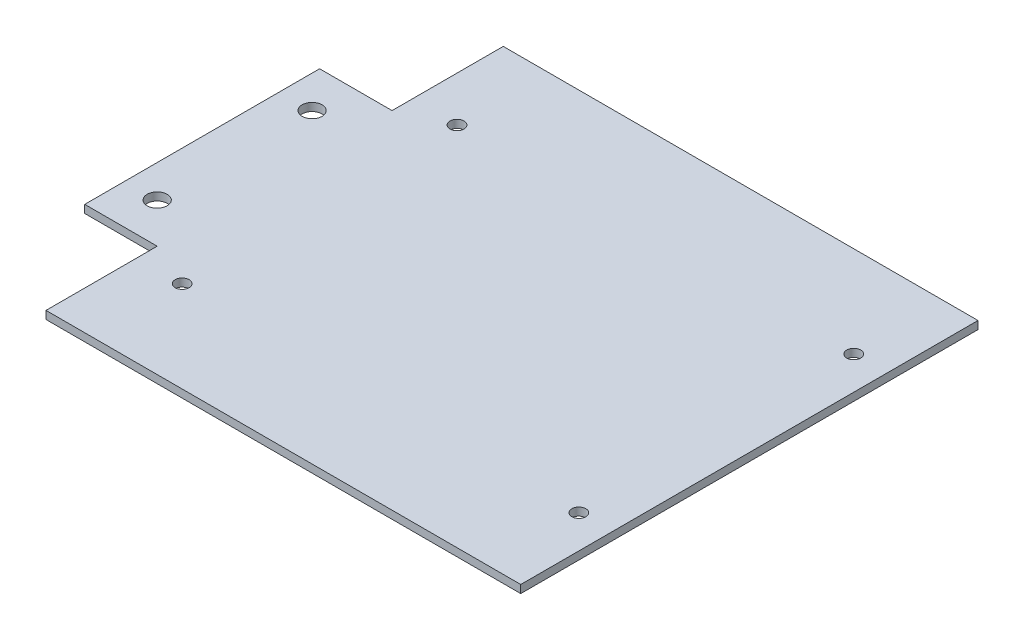
ISO-10303-21;
HEADER;
FILE_DESCRIPTION(('STEP AP214'),'2;1');
FILE_NAME('part.step','',(''),(''),'','','');
FILE_SCHEMA(('AUTOMOTIVE_DESIGN { 1 0 10303 214 1 1 1 1 }'));
ENDSEC;
DATA;
#1=APPLICATION_CONTEXT('core data for automotive mechanical design processes');
#2=APPLICATION_PROTOCOL_DEFINITION('international standard','automotive_design',2000,#1);
#3=PRODUCT_CONTEXT('',#1,'mechanical');
#4=PRODUCT('Part','Part','',(#3));
#5=PRODUCT_RELATED_PRODUCT_CATEGORY('part','',(#4));
#6=PRODUCT_DEFINITION_FORMATION('','',#4);
#7=PRODUCT_DEFINITION_CONTEXT('part definition',#1,'design');
#8=PRODUCT_DEFINITION('design','',#6,#7);
#9=PRODUCT_DEFINITION_SHAPE('','',#8);
#10=(LENGTH_UNIT() NAMED_UNIT(*) SI_UNIT(.MILLI.,.METRE.));
#11=(NAMED_UNIT(*) PLANE_ANGLE_UNIT() SI_UNIT($,.RADIAN.));
#12=(NAMED_UNIT(*) SI_UNIT($,.STERADIAN.) SOLID_ANGLE_UNIT());
#13=UNCERTAINTY_MEASURE_WITH_UNIT(LENGTH_MEASURE(1.E-05),#10,'distance_accuracy_value','');
#14=(GEOMETRIC_REPRESENTATION_CONTEXT(3) GLOBAL_UNCERTAINTY_ASSIGNED_CONTEXT((#13)) GLOBAL_UNIT_ASSIGNED_CONTEXT((#10,
#11,#12)) REPRESENTATION_CONTEXT('',''));
#15=CARTESIAN_POINT('',(0.,0.,0.));
#16=DIRECTION('',(0.,0.,1.));
#17=DIRECTION('',(1.,0.,0.));
#18=AXIS2_PLACEMENT_3D('',#15,#16,#17);
#19=CARTESIAN_POINT('',(95.,-3.17,-91.5));
#20=DIRECTION('',(1.,0.,0.));
#21=DIRECTION('',(0.,0.,-1.));
#22=AXIS2_PLACEMENT_3D('',#19,#20,#21);
#23=PLANE('',#22);
#24=DIRECTION('',(0.,0.,-1.));
#25=VECTOR('',#24,1.);
#26=CARTESIAN_POINT('',(95.,0.,-91.5));
#27=LINE('',#26,#25);
#28=CARTESIAN_POINT('',(95.,0.,91.5));
#29=VERTEX_POINT('',#28);
#30=CARTESIAN_POINT('',(95.,0.,-91.5));
#31=VERTEX_POINT('',#30);
#32=EDGE_CURVE('E139',#29,#31,#27,.T.);
#33=ORIENTED_EDGE('',*,*,#32,.F.);
#34=DIRECTION('',(0.,1.,0.));
#35=VECTOR('',#34,1.);
#36=CARTESIAN_POINT('',(95.,-3.17,91.5));
#37=LINE('',#36,#35);
#38=CARTESIAN_POINT('',(95.,-3.17,91.5));
#39=VERTEX_POINT('',#38);
#40=EDGE_CURVE('E11',#39,#29,#37,.T.);
#41=ORIENTED_EDGE('',*,*,#40,.F.);
#42=DIRECTION('',(0.,0.,-1.));
#43=VECTOR('',#42,1.);
#44=CARTESIAN_POINT('',(95.,-3.17,-91.5));
#45=LINE('',#44,#43);
#46=CARTESIAN_POINT('',(95.,-3.17,-91.5));
#47=VERTEX_POINT('',#46);
#48=EDGE_CURVE('E163',#39,#47,#45,.T.);
#49=ORIENTED_EDGE('',*,*,#48,.T.);
#50=DIRECTION('',(0.,1.,0.));
#51=VECTOR('',#50,1.);
#52=CARTESIAN_POINT('',(95.,-3.17,-91.5));
#53=LINE('',#52,#51);
#54=EDGE_CURVE('E46',#47,#31,#53,.T.);
#55=ORIENTED_EDGE('',*,*,#54,.T.);
#56=EDGE_LOOP('',(#33,#41,#49,#55));
#57=FACE_BOUND('',#56,.T.);
#58=ADVANCED_FACE('F43',(#57),#23,.T.);
#59=CARTESIAN_POINT('',(-95.,-3.17,91.5));
#60=DIRECTION('',(0.,0.,1.));
#61=DIRECTION('',(1.,0.,0.));
#62=AXIS2_PLACEMENT_3D('',#59,#60,#61);
#63=PLANE('',#62);
#64=DIRECTION('',(1.,0.,0.));
#65=VECTOR('',#64,1.);
#66=CARTESIAN_POINT('',(-95.,0.,91.5));
#67=LINE('',#66,#65);
#68=CARTESIAN_POINT('',(-95.,0.,91.5));
#69=VERTEX_POINT('',#68);
#70=EDGE_CURVE('E159',#69,#29,#67,.T.);
#71=ORIENTED_EDGE('',*,*,#70,.F.);
#72=DIRECTION('',(0.,1.,0.));
#73=VECTOR('',#72,1.);
#74=CARTESIAN_POINT('',(-95.,-3.17,91.5));
#75=LINE('',#74,#73);
#76=CARTESIAN_POINT('',(-95.,-3.17,91.5));
#77=VERTEX_POINT('',#76);
#78=EDGE_CURVE('E55',#77,#69,#75,.T.);
#79=ORIENTED_EDGE('',*,*,#78,.F.);
#80=DIRECTION('',(1.,0.,0.));
#81=VECTOR('',#80,1.);
#82=CARTESIAN_POINT('',(-95.,-3.17,91.5));
#83=LINE('',#82,#81);
#84=EDGE_CURVE('E128',#77,#39,#83,.T.);
#85=ORIENTED_EDGE('',*,*,#84,.T.);
#86=ORIENTED_EDGE('',*,*,#40,.T.);
#87=EDGE_LOOP('',(#71,#79,#85,#86));
#88=FACE_BOUND('',#87,.T.);
#89=ADVANCED_FACE('F173',(#88),#63,.T.);
#90=CARTESIAN_POINT('',(-95.,-3.17,47.));
#91=DIRECTION('',(-1.,0.,0.));
#92=DIRECTION('',(0.,0.,1.));
#93=AXIS2_PLACEMENT_3D('',#90,#91,#92);
#94=PLANE('',#93);
#95=DIRECTION('',(0.,0.,1.));
#96=VECTOR('',#95,1.);
#97=CARTESIAN_POINT('',(-95.,0.,47.));
#98=LINE('',#97,#96);
#99=CARTESIAN_POINT('',(-95.,0.,47.));
#100=VERTEX_POINT('',#99);
#101=EDGE_CURVE('E120',#100,#69,#98,.T.);
#102=ORIENTED_EDGE('',*,*,#101,.F.);
#103=DIRECTION('',(0.,1.,0.));
#104=VECTOR('',#103,1.);
#105=CARTESIAN_POINT('',(-95.,-3.17,47.));
#106=LINE('',#105,#104);
#107=CARTESIAN_POINT('',(-95.,-3.17,47.));
#108=VERTEX_POINT('',#107);
#109=EDGE_CURVE('E115',#108,#100,#106,.T.);
#110=ORIENTED_EDGE('',*,*,#109,.F.);
#111=DIRECTION('',(0.,0.,1.));
#112=VECTOR('',#111,1.);
#113=CARTESIAN_POINT('',(-95.,-3.17,47.));
#114=LINE('',#113,#112);
#115=EDGE_CURVE('E114',#108,#77,#114,.T.);
#116=ORIENTED_EDGE('',*,*,#115,.T.);
#117=ORIENTED_EDGE('',*,*,#78,.T.);
#118=EDGE_LOOP('',(#102,#110,#116,#117));
#119=FACE_BOUND('',#118,.T.);
#120=ADVANCED_FACE('F112',(#119),#94,.T.);
#121=CARTESIAN_POINT('',(-124.,-3.17,47.));
#122=DIRECTION('',(0.,0.,1.));
#123=DIRECTION('',(1.,0.,0.));
#124=AXIS2_PLACEMENT_3D('',#121,#122,#123);
#125=PLANE('',#124);
#126=DIRECTION('',(1.,0.,0.));
#127=VECTOR('',#126,1.);
#128=CARTESIAN_POINT('',(-124.,0.,47.));
#129=LINE('',#128,#127);
#130=CARTESIAN_POINT('',(-124.,0.,47.));
#131=VERTEX_POINT('',#130);
#132=EDGE_CURVE('E158',#131,#100,#129,.T.);
#133=ORIENTED_EDGE('',*,*,#132,.F.);
#134=DIRECTION('',(0.,1.,0.));
#135=VECTOR('',#134,1.);
#136=CARTESIAN_POINT('',(-124.,-3.17,47.));
#137=LINE('',#136,#135);
#138=CARTESIAN_POINT('',(-124.,-3.17,47.));
#139=VERTEX_POINT('',#138);
#140=EDGE_CURVE('E125',#139,#131,#137,.T.);
#141=ORIENTED_EDGE('',*,*,#140,.F.);
#142=DIRECTION('',(1.,0.,0.));
#143=VECTOR('',#142,1.);
#144=CARTESIAN_POINT('',(-124.,-3.17,47.));
#145=LINE('',#144,#143);
#146=EDGE_CURVE('E129',#139,#108,#145,.T.);
#147=ORIENTED_EDGE('',*,*,#146,.T.);
#148=ORIENTED_EDGE('',*,*,#109,.T.);
#149=EDGE_LOOP('',(#133,#141,#147,#148));
#150=FACE_BOUND('',#149,.T.);
#151=ADVANCED_FACE('F134',(#150),#125,.T.);
#152=CARTESIAN_POINT('',(-124.,-3.17,-47.));
#153=DIRECTION('',(-1.,0.,0.));
#154=DIRECTION('',(0.,0.,1.));
#155=AXIS2_PLACEMENT_3D('',#152,#153,#154);
#156=PLANE('',#155);
#157=DIRECTION('',(0.,0.,1.));
#158=VECTOR('',#157,1.);
#159=CARTESIAN_POINT('',(-124.,0.,-47.));
#160=LINE('',#159,#158);
#161=CARTESIAN_POINT('',(-124.,0.,-47.));
#162=VERTEX_POINT('',#161);
#163=EDGE_CURVE('E152',#162,#131,#160,.T.);
#164=ORIENTED_EDGE('',*,*,#163,.F.);
#165=DIRECTION('',(0.,1.,0.));
#166=VECTOR('',#165,1.);
#167=CARTESIAN_POINT('',(-124.,-3.17,-47.));
#168=LINE('',#167,#166);
#169=CARTESIAN_POINT('',(-124.,-3.17,-47.));
#170=VERTEX_POINT('',#169);
#171=EDGE_CURVE('E164',#170,#162,#168,.T.);
#172=ORIENTED_EDGE('',*,*,#171,.F.);
#173=DIRECTION('',(0.,0.,1.));
#174=VECTOR('',#173,1.);
#175=CARTESIAN_POINT('',(-124.,-3.17,-47.));
#176=LINE('',#175,#174);
#177=EDGE_CURVE('E132',#170,#139,#176,.T.);
#178=ORIENTED_EDGE('',*,*,#177,.T.);
#179=ORIENTED_EDGE('',*,*,#140,.T.);
#180=EDGE_LOOP('',(#164,#172,#178,#179));
#181=FACE_BOUND('',#180,.T.);
#182=ADVANCED_FACE('F187',(#181),#156,.T.);
#183=CARTESIAN_POINT('',(-95.,-3.17,-47.));
#184=DIRECTION('',(0.,0.,-1.));
#185=DIRECTION('',(-1.,0.,0.));
#186=AXIS2_PLACEMENT_3D('',#183,#184,#185);
#187=PLANE('',#186);
#188=DIRECTION('',(-1.,0.,0.));
#189=VECTOR('',#188,1.);
#190=CARTESIAN_POINT('',(-95.,0.,-47.));
#191=LINE('',#190,#189);
#192=CARTESIAN_POINT('',(-95.,0.,-47.));
#193=VERTEX_POINT('',#192);
#194=EDGE_CURVE('E148',#193,#162,#191,.T.);
#195=ORIENTED_EDGE('',*,*,#194,.F.);
#196=DIRECTION('',(0.,1.,0.));
#197=VECTOR('',#196,1.);
#198=CARTESIAN_POINT('',(-95.,-3.17,-47.));
#199=LINE('',#198,#197);
#200=CARTESIAN_POINT('',(-95.,-3.17,-47.));
#201=VERTEX_POINT('',#200);
#202=EDGE_CURVE('E170',#201,#193,#199,.T.);
#203=ORIENTED_EDGE('',*,*,#202,.F.);
#204=DIRECTION('',(-1.,0.,0.));
#205=VECTOR('',#204,1.);
#206=CARTESIAN_POINT('',(-95.,-3.17,-47.));
#207=LINE('',#206,#205);
#208=EDGE_CURVE('E131',#201,#170,#207,.T.);
#209=ORIENTED_EDGE('',*,*,#208,.T.);
#210=ORIENTED_EDGE('',*,*,#171,.T.);
#211=EDGE_LOOP('',(#195,#203,#209,#210));
#212=FACE_BOUND('',#211,.T.);
#213=ADVANCED_FACE('F186',(#212),#187,.T.);
#214=CARTESIAN_POINT('',(-95.,-3.17,-91.5));
#215=DIRECTION('',(-1.,0.,0.));
#216=DIRECTION('',(0.,0.,1.));
#217=AXIS2_PLACEMENT_3D('',#214,#215,#216);
#218=PLANE('',#217);
#219=DIRECTION('',(0.,0.,1.));
#220=VECTOR('',#219,1.);
#221=CARTESIAN_POINT('',(-95.,0.,-91.5));
#222=LINE('',#221,#220);
#223=CARTESIAN_POINT('',(-95.,0.,-91.5));
#224=VERTEX_POINT('',#223);
#225=EDGE_CURVE('E150',#224,#193,#222,.T.);
#226=ORIENTED_EDGE('',*,*,#225,.F.);
#227=DIRECTION('',(0.,1.,0.));
#228=VECTOR('',#227,1.);
#229=CARTESIAN_POINT('',(-95.,-3.17,-91.5));
#230=LINE('',#229,#228);
#231=CARTESIAN_POINT('',(-95.,-3.17,-91.5));
#232=VERTEX_POINT('',#231);
#233=EDGE_CURVE('E166',#232,#224,#230,.T.);
#234=ORIENTED_EDGE('',*,*,#233,.F.);
#235=DIRECTION('',(0.,0.,1.));
#236=VECTOR('',#235,1.);
#237=CARTESIAN_POINT('',(-95.,-3.17,-91.5));
#238=LINE('',#237,#236);
#239=EDGE_CURVE('E273',#232,#201,#238,.T.);
#240=ORIENTED_EDGE('',*,*,#239,.T.);
#241=ORIENTED_EDGE('',*,*,#202,.T.);
#242=EDGE_LOOP('',(#226,#234,#240,#241));
#243=FACE_BOUND('',#242,.T.);
#244=ADVANCED_FACE('F194',(#243),#218,.T.);
#245=CARTESIAN_POINT('',(-95.,-3.17,-91.5));
#246=DIRECTION('',(0.,0.,-1.));
#247=DIRECTION('',(-1.,0.,0.));
#248=AXIS2_PLACEMENT_3D('',#245,#246,#247);
#249=PLANE('',#248);
#250=DIRECTION('',(-1.,0.,0.));
#251=VECTOR('',#250,1.);
#252=CARTESIAN_POINT('',(-95.,0.,-91.5));
#253=LINE('',#252,#251);
#254=EDGE_CURVE('E141',#31,#224,#253,.T.);
#255=ORIENTED_EDGE('',*,*,#254,.F.);
#256=ORIENTED_EDGE('',*,*,#54,.F.);
#257=DIRECTION('',(-1.,0.,0.));
#258=VECTOR('',#257,1.);
#259=CARTESIAN_POINT('',(-95.,-3.17,-91.5));
#260=LINE('',#259,#258);
#261=EDGE_CURVE('E271',#47,#232,#260,.T.);
#262=ORIENTED_EDGE('',*,*,#261,.T.);
#263=ORIENTED_EDGE('',*,*,#233,.T.);
#264=EDGE_LOOP('',(#255,#256,#262,#263));
#265=FACE_BOUND('',#264,.T.);
#266=ADVANCED_FACE('F167',(#265),#249,.T.);
#267=CARTESIAN_POINT('',(0.,-3.17,0.));
#268=DIRECTION('',(0.,1.,0.));
#269=DIRECTION('',(0.,0.,1.));
#270=AXIS2_PLACEMENT_3D('',#267,#268,#269);
#271=PLANE('',#270);
#272=CARTESIAN_POINT('',(-111.,-3.17,31.));
#273=DIRECTION('',(0.,1.,0.));
#274=DIRECTION('',(0.,0.,1.));
#275=AXIS2_PLACEMENT_3D('',#272,#273,#274);
#276=CIRCLE('',#275,4.00000000000001);
#277=CARTESIAN_POINT('',(-111.,-3.17,35.));
#278=VERTEX_POINT('',#277);
#279=EDGE_CURVE('E236',#278,#278,#276,.T.);
#280=ORIENTED_EDGE('',*,*,#279,.T.);
#281=EDGE_LOOP('',(#280));
#282=FACE_BOUND('',#281,.T.);
#283=CARTESIAN_POINT('',(-111.,-3.17,-31.));
#284=DIRECTION('',(0.,1.,0.));
#285=DIRECTION('',(0.,0.,1.));
#286=AXIS2_PLACEMENT_3D('',#283,#284,#285);
#287=CIRCLE('',#286,4.00000000000001);
#288=CARTESIAN_POINT('',(-111.,-3.17,-27.));
#289=VERTEX_POINT('',#288);
#290=EDGE_CURVE('E242',#289,#289,#287,.T.);
#291=ORIENTED_EDGE('',*,*,#290,.T.);
#292=EDGE_LOOP('',(#291));
#293=FACE_BOUND('',#292,.T.);
#294=CARTESIAN_POINT('',(81.76,-3.17,-55.0037));
#295=DIRECTION('',(0.,1.,0.));
#296=DIRECTION('',(0.,0.,1.));
#297=AXIS2_PLACEMENT_3D('',#294,#295,#296);
#298=CIRCLE('',#297,2.79999999999999);
#299=CARTESIAN_POINT('',(81.76,-3.17,-52.2037));
#300=VERTEX_POINT('',#299);
#301=EDGE_CURVE('E249',#300,#300,#298,.T.);
#302=ORIENTED_EDGE('',*,*,#301,.T.);
#303=EDGE_LOOP('',(#302));
#304=FACE_BOUND('',#303,.T.);
#305=CARTESIAN_POINT('',(81.76,-3.17,55.0037));
#306=DIRECTION('',(0.,1.,0.));
#307=DIRECTION('',(0.,0.,1.));
#308=AXIS2_PLACEMENT_3D('',#305,#306,#307);
#309=CIRCLE('',#308,2.79999999999999);
#310=CARTESIAN_POINT('',(81.76,-3.17,57.8037));
#311=VERTEX_POINT('',#310);
#312=EDGE_CURVE('E257',#311,#311,#309,.T.);
#313=ORIENTED_EDGE('',*,*,#312,.T.);
#314=EDGE_LOOP('',(#313));
#315=FACE_BOUND('',#314,.T.);
#316=CARTESIAN_POINT('',(-77.,-3.17,55.0037));
#317=DIRECTION('',(0.,1.,0.));
#318=DIRECTION('',(0.,0.,1.));
#319=AXIS2_PLACEMENT_3D('',#316,#317,#318);
#320=CIRCLE('',#319,2.79999999999999);
#321=CARTESIAN_POINT('',(-77.,-3.17,57.8037));
#322=VERTEX_POINT('',#321);
#323=EDGE_CURVE('E264',#322,#322,#320,.T.);
#324=ORIENTED_EDGE('',*,*,#323,.T.);
#325=EDGE_LOOP('',(#324));
#326=FACE_BOUND('',#325,.T.);
#327=CARTESIAN_POINT('',(-77.,-3.17,-55.0037));
#328=DIRECTION('',(0.,1.,0.));
#329=DIRECTION('',(0.,0.,1.));
#330=AXIS2_PLACEMENT_3D('',#327,#328,#329);
#331=CIRCLE('',#330,2.79999999999999);
#332=CARTESIAN_POINT('',(-77.,-3.17,-52.2037));
#333=VERTEX_POINT('',#332);
#334=EDGE_CURVE('E144',#333,#333,#331,.T.);
#335=ORIENTED_EDGE('',*,*,#334,.T.);
#336=EDGE_LOOP('',(#335));
#337=FACE_BOUND('',#336,.T.);
#338=ORIENTED_EDGE('',*,*,#48,.F.);
#339=ORIENTED_EDGE('',*,*,#84,.F.);
#340=ORIENTED_EDGE('',*,*,#115,.F.);
#341=ORIENTED_EDGE('',*,*,#146,.F.);
#342=ORIENTED_EDGE('',*,*,#177,.F.);
#343=ORIENTED_EDGE('',*,*,#208,.F.);
#344=ORIENTED_EDGE('',*,*,#239,.F.);
#345=ORIENTED_EDGE('',*,*,#261,.F.);
#346=EDGE_LOOP('',(#338,#339,#340,#341,#342,#343,#344,#345));
#347=FACE_BOUND('',#346,.T.);
#348=ADVANCED_FACE('F127',(#282,#293,#304,#315,#326,#337,#347),#271,.F.);
#349=CARTESIAN_POINT('',(0.,0.,0.));
#350=DIRECTION('',(0.,1.,0.));
#351=DIRECTION('',(0.,0.,1.));
#352=AXIS2_PLACEMENT_3D('',#349,#350,#351);
#353=PLANE('',#352);
#354=CARTESIAN_POINT('',(-111.,0.,31.));
#355=DIRECTION('',(0.,1.,0.));
#356=DIRECTION('',(0.,0.,1.));
#357=AXIS2_PLACEMENT_3D('',#354,#355,#356);
#358=CIRCLE('',#357,4.00000000000001);
#359=CARTESIAN_POINT('',(-111.,0.,35.));
#360=VERTEX_POINT('',#359);
#361=EDGE_CURVE('E237',#360,#360,#358,.T.);
#362=ORIENTED_EDGE('',*,*,#361,.F.);
#363=EDGE_LOOP('',(#362));
#364=FACE_BOUND('',#363,.T.);
#365=CARTESIAN_POINT('',(-111.,0.,-31.));
#366=DIRECTION('',(0.,1.,0.));
#367=DIRECTION('',(0.,0.,1.));
#368=AXIS2_PLACEMENT_3D('',#365,#366,#367);
#369=CIRCLE('',#368,4.00000000000001);
#370=CARTESIAN_POINT('',(-111.,0.,-27.));
#371=VERTEX_POINT('',#370);
#372=EDGE_CURVE('E241',#371,#371,#369,.T.);
#373=ORIENTED_EDGE('',*,*,#372,.F.);
#374=EDGE_LOOP('',(#373));
#375=FACE_BOUND('',#374,.T.);
#376=CARTESIAN_POINT('',(81.76,0.,-55.0037));
#377=DIRECTION('',(0.,1.,0.));
#378=DIRECTION('',(0.,0.,1.));
#379=AXIS2_PLACEMENT_3D('',#376,#377,#378);
#380=CIRCLE('',#379,2.79999999999999);
#381=CARTESIAN_POINT('',(81.76,0.,-52.2037));
#382=VERTEX_POINT('',#381);
#383=EDGE_CURVE('E250',#382,#382,#380,.T.);
#384=ORIENTED_EDGE('',*,*,#383,.F.);
#385=EDGE_LOOP('',(#384));
#386=FACE_BOUND('',#385,.T.);
#387=CARTESIAN_POINT('',(81.76,0.,55.0037));
#388=DIRECTION('',(0.,1.,0.));
#389=DIRECTION('',(0.,0.,1.));
#390=AXIS2_PLACEMENT_3D('',#387,#388,#389);
#391=CIRCLE('',#390,2.79999999999999);
#392=CARTESIAN_POINT('',(81.76,0.,57.8037));
#393=VERTEX_POINT('',#392);
#394=EDGE_CURVE('E254',#393,#393,#391,.T.);
#395=ORIENTED_EDGE('',*,*,#394,.F.);
#396=EDGE_LOOP('',(#395));
#397=FACE_BOUND('',#396,.T.);
#398=CARTESIAN_POINT('',(-77.,0.,55.0037));
#399=DIRECTION('',(0.,1.,0.));
#400=DIRECTION('',(0.,0.,1.));
#401=AXIS2_PLACEMENT_3D('',#398,#399,#400);
#402=CIRCLE('',#401,2.79999999999999);
#403=CARTESIAN_POINT('',(-77.,0.,57.8037));
#404=VERTEX_POINT('',#403);
#405=EDGE_CURVE('E256',#404,#404,#402,.T.);
#406=ORIENTED_EDGE('',*,*,#405,.F.);
#407=EDGE_LOOP('',(#406));
#408=FACE_BOUND('',#407,.T.);
#409=CARTESIAN_POINT('',(-77.,0.,-55.0037));
#410=DIRECTION('',(0.,1.,0.));
#411=DIRECTION('',(0.,0.,1.));
#412=AXIS2_PLACEMENT_3D('',#409,#410,#411);
#413=CIRCLE('',#412,2.79999999999999);
#414=CARTESIAN_POINT('',(-77.,0.,-52.2037));
#415=VERTEX_POINT('',#414);
#416=EDGE_CURVE('E261',#415,#415,#413,.T.);
#417=ORIENTED_EDGE('',*,*,#416,.F.);
#418=EDGE_LOOP('',(#417));
#419=FACE_BOUND('',#418,.T.);
#420=ORIENTED_EDGE('',*,*,#32,.T.);
#421=ORIENTED_EDGE('',*,*,#254,.T.);
#422=ORIENTED_EDGE('',*,*,#225,.T.);
#423=ORIENTED_EDGE('',*,*,#194,.T.);
#424=ORIENTED_EDGE('',*,*,#163,.T.);
#425=ORIENTED_EDGE('',*,*,#132,.T.);
#426=ORIENTED_EDGE('',*,*,#101,.T.);
#427=ORIENTED_EDGE('',*,*,#70,.T.);
#428=EDGE_LOOP('',(#420,#421,#422,#423,#424,#425,#426,#427));
#429=FACE_BOUND('',#428,.T.);
#430=ADVANCED_FACE('F175',(#364,#375,#386,#397,#408,#419,#429),#353,.T.);
#431=CARTESIAN_POINT('',(-77.,-3.17,-55.0037));
#432=DIRECTION('',(0.,1.,0.));
#433=DIRECTION('',(0.,0.,1.));
#434=AXIS2_PLACEMENT_3D('',#431,#432,#433);
#435=CYLINDRICAL_SURFACE('',#434,2.79999999999999);
#436=ORIENTED_EDGE('',*,*,#334,.F.);
#437=EDGE_LOOP('',(#436));
#438=FACE_BOUND('',#437,.T.);
#439=ORIENTED_EDGE('',*,*,#416,.T.);
#440=EDGE_LOOP('',(#439));
#441=FACE_BOUND('',#440,.T.);
#442=ADVANCED_FACE('F204',(#438,#441),#435,.F.);
#443=CARTESIAN_POINT('',(-77.,-3.17,55.0037));
#444=DIRECTION('',(0.,1.,0.));
#445=DIRECTION('',(0.,0.,1.));
#446=AXIS2_PLACEMENT_3D('',#443,#444,#445);
#447=CYLINDRICAL_SURFACE('',#446,2.79999999999999);
#448=ORIENTED_EDGE('',*,*,#323,.F.);
#449=EDGE_LOOP('',(#448));
#450=FACE_BOUND('',#449,.T.);
#451=ORIENTED_EDGE('',*,*,#405,.T.);
#452=EDGE_LOOP('',(#451));
#453=FACE_BOUND('',#452,.T.);
#454=ADVANCED_FACE('F215',(#450,#453),#447,.F.);
#455=CARTESIAN_POINT('',(81.76,-3.17,55.0037));
#456=DIRECTION('',(0.,1.,0.));
#457=DIRECTION('',(0.,0.,1.));
#458=AXIS2_PLACEMENT_3D('',#455,#456,#457);
#459=CYLINDRICAL_SURFACE('',#458,2.79999999999999);
#460=ORIENTED_EDGE('',*,*,#312,.F.);
#461=EDGE_LOOP('',(#460));
#462=FACE_BOUND('',#461,.T.);
#463=ORIENTED_EDGE('',*,*,#394,.T.);
#464=EDGE_LOOP('',(#463));
#465=FACE_BOUND('',#464,.T.);
#466=ADVANCED_FACE('F218',(#462,#465),#459,.F.);
#467=CARTESIAN_POINT('',(81.76,-3.17,-55.0037));
#468=DIRECTION('',(0.,1.,0.));
#469=DIRECTION('',(0.,0.,1.));
#470=AXIS2_PLACEMENT_3D('',#467,#468,#469);
#471=CYLINDRICAL_SURFACE('',#470,2.79999999999999);
#472=ORIENTED_EDGE('',*,*,#301,.F.);
#473=EDGE_LOOP('',(#472));
#474=FACE_BOUND('',#473,.T.);
#475=ORIENTED_EDGE('',*,*,#383,.T.);
#476=EDGE_LOOP('',(#475));
#477=FACE_BOUND('',#476,.T.);
#478=ADVANCED_FACE('F216',(#474,#477),#471,.F.);
#479=CARTESIAN_POINT('',(-111.,-3.17,-31.));
#480=DIRECTION('',(0.,1.,0.));
#481=DIRECTION('',(0.,0.,1.));
#482=AXIS2_PLACEMENT_3D('',#479,#480,#481);
#483=CYLINDRICAL_SURFACE('',#482,4.00000000000001);
#484=ORIENTED_EDGE('',*,*,#290,.F.);
#485=EDGE_LOOP('',(#484));
#486=FACE_BOUND('',#485,.T.);
#487=ORIENTED_EDGE('',*,*,#372,.T.);
#488=EDGE_LOOP('',(#487));
#489=FACE_BOUND('',#488,.T.);
#490=ADVANCED_FACE('F224',(#486,#489),#483,.F.);
#491=CARTESIAN_POINT('',(-111.,-3.17,31.));
#492=DIRECTION('',(0.,1.,0.));
#493=DIRECTION('',(0.,0.,1.));
#494=AXIS2_PLACEMENT_3D('',#491,#492,#493);
#495=CYLINDRICAL_SURFACE('',#494,4.00000000000001);
#496=ORIENTED_EDGE('',*,*,#279,.F.);
#497=EDGE_LOOP('',(#496));
#498=FACE_BOUND('',#497,.T.);
#499=ORIENTED_EDGE('',*,*,#361,.T.);
#500=EDGE_LOOP('',(#499));
#501=FACE_BOUND('',#500,.T.);
#502=ADVANCED_FACE('F226',(#498,#501),#495,.F.);
#503=CLOSED_SHELL('',(#58,#89,#120,#151,#182,#213,#244,#266,#348,#430,#442,#454,#466,#478,#490,#502));
#504=MANIFOLD_SOLID_BREP('B2',#503);
#505=ADVANCED_BREP_SHAPE_REPRESENTATION('',(#18,#504),#14);
#506=SHAPE_DEFINITION_REPRESENTATION(#9,#505);
ENDSEC;
END-ISO-10303-21;
